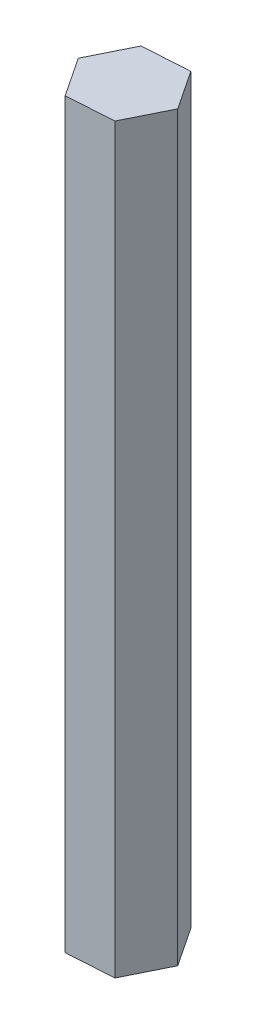
ISO-10303-21;
HEADER;
FILE_DESCRIPTION(('STEP AP214'),'2;1');
FILE_NAME('part.step','',(''),(''),'','','');
FILE_SCHEMA(('AUTOMOTIVE_DESIGN { 1 0 10303 214 1 1 1 1 }'));
ENDSEC;
DATA;
#1=APPLICATION_CONTEXT('core data for automotive mechanical design processes');
#2=APPLICATION_PROTOCOL_DEFINITION('international standard','automotive_design',2000,#1);
#3=PRODUCT_CONTEXT('',#1,'mechanical');
#4=PRODUCT('Part','Part','',(#3));
#5=PRODUCT_RELATED_PRODUCT_CATEGORY('part','',(#4));
#6=PRODUCT_DEFINITION_FORMATION('','',#4);
#7=PRODUCT_DEFINITION_CONTEXT('part definition',#1,'design');
#8=PRODUCT_DEFINITION('design','',#6,#7);
#9=PRODUCT_DEFINITION_SHAPE('','',#8);
#10=(LENGTH_UNIT() NAMED_UNIT(*) SI_UNIT(.MILLI.,.METRE.));
#11=(NAMED_UNIT(*) PLANE_ANGLE_UNIT() SI_UNIT($,.RADIAN.));
#12=(NAMED_UNIT(*) SI_UNIT($,.STERADIAN.) SOLID_ANGLE_UNIT());
#13=UNCERTAINTY_MEASURE_WITH_UNIT(LENGTH_MEASURE(1.E-05),#10,'distance_accuracy_value','');
#14=(GEOMETRIC_REPRESENTATION_CONTEXT(3) GLOBAL_UNCERTAINTY_ASSIGNED_CONTEXT((#13)) GLOBAL_UNIT_ASSIGNED_CONTEXT((#10,
#11,#12)) REPRESENTATION_CONTEXT('',''));
#15=CARTESIAN_POINT('',(0.,0.,0.));
#16=DIRECTION('',(0.,0.,1.));
#17=DIRECTION('',(1.,0.,0.));
#18=AXIS2_PLACEMENT_3D('',#15,#16,#17);
#19=CARTESIAN_POINT('',(7.31785977013899,116.078,-0.460718697162052));
#20=DIRECTION('',(-0.832897288147061,0.,0.553427599056346));
#21=DIRECTION('',(0.553427599056346,0.,0.832897288147061));
#22=AXIS2_PLACEMENT_3D('',#19,#20,#21);
#23=PLANE('',#22);
#24=DIRECTION('',(-0.553427599056346,0.,-0.832897288147061));
#25=VECTOR('',#24,1.);
#26=CARTESIAN_POINT('',(7.31785977013899,0.,-0.460718697162052));
#27=LINE('',#26,#25);
#28=CARTESIAN_POINT('',(7.31785977013899,0.,-0.460718697162052));
#29=VERTEX_POINT('',#28);
#30=CARTESIAN_POINT('',(3.25993578932869,0.,-6.56781181085354));
#31=VERTEX_POINT('',#30);
#32=EDGE_CURVE('E127',#29,#31,#27,.T.);
#33=ORIENTED_EDGE('',*,*,#32,.T.);
#34=DIRECTION('',(0.,-1.,0.));
#35=VECTOR('',#34,1.);
#36=CARTESIAN_POINT('',(3.25993578932869,116.078,-6.56781181085354));
#37=LINE('',#36,#35);
#38=CARTESIAN_POINT('',(3.25993578932869,116.078,-6.56781181085354));
#39=VERTEX_POINT('',#38);
#40=EDGE_CURVE('E11',#39,#31,#37,.T.);
#41=ORIENTED_EDGE('',*,*,#40,.F.);
#42=DIRECTION('',(-0.553427599056346,0.,-0.832897288147061));
#43=VECTOR('',#42,1.);
#44=CARTESIAN_POINT('',(7.31785977013899,116.078,-0.460718697162052));
#45=LINE('',#44,#43);
#46=CARTESIAN_POINT('',(7.31785977013899,116.078,-0.460718697162052));
#47=VERTEX_POINT('',#46);
#48=EDGE_CURVE('E137',#47,#39,#45,.T.);
#49=ORIENTED_EDGE('',*,*,#48,.F.);
#50=DIRECTION('',(0.,-1.,0.));
#51=VECTOR('',#50,1.);
#52=CARTESIAN_POINT('',(7.31785977013899,116.078,-0.460718697162052));
#53=LINE('',#52,#51);
#54=EDGE_CURVE('E123',#47,#29,#53,.T.);
#55=ORIENTED_EDGE('',*,*,#54,.T.);
#56=EDGE_LOOP('',(#33,#41,#49,#55));
#57=FACE_BOUND('',#56,.T.);
#58=ADVANCED_FACE('F43',(#57),#23,.F.);
#59=CARTESIAN_POINT('',(3.25993578932869,116.078,-6.56781181085354));
#60=DIRECTION('',(0.0628337158646939,0.,0.998024009806695));
#61=DIRECTION('',(0.998024009806695,0.,-0.0628337158646939));
#62=AXIS2_PLACEMENT_3D('',#59,#60,#61);
#63=PLANE('',#62);
#64=DIRECTION('',(-0.998024009806695,0.,0.0628337158646939));
#65=VECTOR('',#64,1.);
#66=CARTESIAN_POINT('',(3.25993578932869,0.,-6.56781181085354));
#67=LINE('',#66,#65);
#68=CARTESIAN_POINT('',(-4.0579239808103,0.,-6.10709311369149));
#69=VERTEX_POINT('',#68);
#70=EDGE_CURVE('E130',#31,#69,#67,.T.);
#71=ORIENTED_EDGE('',*,*,#70,.T.);
#72=DIRECTION('',(0.,-1.,0.));
#73=VECTOR('',#72,1.);
#74=CARTESIAN_POINT('',(-4.0579239808103,116.078,-6.10709311369149));
#75=LINE('',#74,#73);
#76=CARTESIAN_POINT('',(-4.0579239808103,116.078,-6.10709311369149));
#77=VERTEX_POINT('',#76);
#78=EDGE_CURVE('E51',#77,#69,#75,.T.);
#79=ORIENTED_EDGE('',*,*,#78,.F.);
#80=DIRECTION('',(-0.998024009806695,0.,0.0628337158646939));
#81=VECTOR('',#80,1.);
#82=CARTESIAN_POINT('',(3.25993578932869,116.078,-6.56781181085354));
#83=LINE('',#82,#81);
#84=EDGE_CURVE('E96',#39,#77,#83,.T.);
#85=ORIENTED_EDGE('',*,*,#84,.F.);
#86=ORIENTED_EDGE('',*,*,#40,.T.);
#87=EDGE_LOOP('',(#71,#79,#85,#86));
#88=FACE_BOUND('',#87,.T.);
#89=ADVANCED_FACE('F161',(#88),#63,.F.);
#90=CARTESIAN_POINT('',(-4.0579239808103,116.078,-6.10709311369149));
#91=DIRECTION('',(0.895731004011755,0.,0.444596410750349));
#92=DIRECTION('',(0.444596410750349,0.,-0.895731004011755));
#93=AXIS2_PLACEMENT_3D('',#90,#91,#92);
#94=PLANE('',#93);
#95=DIRECTION('',(-0.444596410750349,0.,0.895731004011755));
#96=VECTOR('',#95,1.);
#97=CARTESIAN_POINT('',(-4.0579239808103,0.,-6.10709311369149));
#98=LINE('',#97,#96);
#99=CARTESIAN_POINT('',(-7.31785977013899,0.,0.460718697162054));
#100=VERTEX_POINT('',#99);
#101=EDGE_CURVE('E132',#69,#100,#98,.T.);
#102=ORIENTED_EDGE('',*,*,#101,.T.);
#103=DIRECTION('',(0.,-1.,0.));
#104=VECTOR('',#103,1.);
#105=CARTESIAN_POINT('',(-7.31785977013899,116.078,0.460718697162054));
#106=LINE('',#105,#104);
#107=CARTESIAN_POINT('',(-7.31785977013899,116.078,0.460718697162054));
#108=VERTEX_POINT('',#107);
#109=EDGE_CURVE('E118',#108,#100,#106,.T.);
#110=ORIENTED_EDGE('',*,*,#109,.F.);
#111=DIRECTION('',(-0.444596410750349,0.,0.895731004011755));
#112=VECTOR('',#111,1.);
#113=CARTESIAN_POINT('',(-4.0579239808103,116.078,-6.10709311369149));
#114=LINE('',#113,#112);
#115=EDGE_CURVE('E109',#77,#108,#114,.T.);
#116=ORIENTED_EDGE('',*,*,#115,.F.);
#117=ORIENTED_EDGE('',*,*,#78,.T.);
#118=EDGE_LOOP('',(#102,#110,#116,#117));
#119=FACE_BOUND('',#118,.T.);
#120=ADVANCED_FACE('F143',(#119),#94,.F.);
#121=CARTESIAN_POINT('',(-7.31785977013899,116.078,0.460718697162054));
#122=DIRECTION('',(0.832897288147061,0.,-0.553427599056346));
#123=DIRECTION('',(-0.553427599056346,0.,-0.832897288147061));
#124=AXIS2_PLACEMENT_3D('',#121,#122,#123);
#125=PLANE('',#124);
#126=DIRECTION('',(0.553427599056346,0.,0.832897288147061));
#127=VECTOR('',#126,1.);
#128=CARTESIAN_POINT('',(-7.31785977013899,0.,0.460718697162054));
#129=LINE('',#128,#127);
#130=CARTESIAN_POINT('',(-3.25993578932868,0.,6.56781181085354));
#131=VERTEX_POINT('',#130);
#132=EDGE_CURVE('E117',#100,#131,#129,.T.);
#133=ORIENTED_EDGE('',*,*,#132,.T.);
#134=DIRECTION('',(0.,-1.,0.));
#135=VECTOR('',#134,1.);
#136=CARTESIAN_POINT('',(-3.25993578932868,116.078,6.56781181085354));
#137=LINE('',#136,#135);
#138=CARTESIAN_POINT('',(-3.25993578932868,116.078,6.56781181085354));
#139=VERTEX_POINT('',#138);
#140=EDGE_CURVE('E114',#139,#131,#137,.T.);
#141=ORIENTED_EDGE('',*,*,#140,.F.);
#142=DIRECTION('',(0.553427599056346,0.,0.832897288147061));
#143=VECTOR('',#142,1.);
#144=CARTESIAN_POINT('',(-7.31785977013899,116.078,0.460718697162054));
#145=LINE('',#144,#143);
#146=EDGE_CURVE('E103',#108,#139,#145,.T.);
#147=ORIENTED_EDGE('',*,*,#146,.F.);
#148=ORIENTED_EDGE('',*,*,#109,.T.);
#149=EDGE_LOOP('',(#133,#141,#147,#148));
#150=FACE_BOUND('',#149,.T.);
#151=ADVANCED_FACE('F115',(#150),#125,.F.);
#152=CARTESIAN_POINT('',(-3.25993578932868,116.078,6.56781181085354));
#153=DIRECTION('',(-0.0628337158646941,0.,-0.998024009806696));
#154=DIRECTION('',(-0.998024009806695,0.,0.062833715864694));
#155=AXIS2_PLACEMENT_3D('',#152,#153,#154);
#156=PLANE('',#155);
#157=DIRECTION('',(0.998024009806695,0.,-0.062833715864694));
#158=VECTOR('',#157,1.);
#159=CARTESIAN_POINT('',(-3.25993578932868,0.,6.56781181085354));
#160=LINE('',#159,#158);
#161=CARTESIAN_POINT('',(4.0579239808103,0.,6.10709311369149));
#162=VERTEX_POINT('',#161);
#163=EDGE_CURVE('E82',#131,#162,#160,.T.);
#164=ORIENTED_EDGE('',*,*,#163,.T.);
#165=DIRECTION('',(0.,-1.,0.));
#166=VECTOR('',#165,1.);
#167=CARTESIAN_POINT('',(4.0579239808103,116.078,6.10709311369149));
#168=LINE('',#167,#166);
#169=CARTESIAN_POINT('',(4.0579239808103,116.078,6.10709311369149));
#170=VERTEX_POINT('',#169);
#171=EDGE_CURVE('E119',#170,#162,#168,.T.);
#172=ORIENTED_EDGE('',*,*,#171,.F.);
#173=DIRECTION('',(0.998024009806695,0.,-0.062833715864694));
#174=VECTOR('',#173,1.);
#175=CARTESIAN_POINT('',(-3.25993578932868,116.078,6.56781181085354));
#176=LINE('',#175,#174);
#177=EDGE_CURVE('E107',#139,#170,#176,.T.);
#178=ORIENTED_EDGE('',*,*,#177,.F.);
#179=ORIENTED_EDGE('',*,*,#140,.T.);
#180=EDGE_LOOP('',(#164,#172,#178,#179));
#181=FACE_BOUND('',#180,.T.);
#182=ADVANCED_FACE('F121',(#181),#156,.F.);
#183=CARTESIAN_POINT('',(4.0579239808103,116.078,6.10709311369149));
#184=DIRECTION('',(-0.895731004011755,0.,-0.444596410750349));
#185=DIRECTION('',(-0.444596410750349,0.,0.895731004011755));
#186=AXIS2_PLACEMENT_3D('',#183,#184,#185);
#187=PLANE('',#186);
#188=DIRECTION('',(0.444596410750349,0.,-0.895731004011755));
#189=VECTOR('',#188,1.);
#190=CARTESIAN_POINT('',(4.0579239808103,0.,6.10709311369149));
#191=LINE('',#190,#189);
#192=EDGE_CURVE('E88',#162,#29,#191,.T.);
#193=ORIENTED_EDGE('',*,*,#192,.T.);
#194=ORIENTED_EDGE('',*,*,#54,.F.);
#195=DIRECTION('',(0.444596410750349,0.,-0.895731004011755));
#196=VECTOR('',#195,1.);
#197=CARTESIAN_POINT('',(4.0579239808103,116.078,6.10709311369149));
#198=LINE('',#197,#196);
#199=EDGE_CURVE('E59',#170,#47,#198,.T.);
#200=ORIENTED_EDGE('',*,*,#199,.F.);
#201=ORIENTED_EDGE('',*,*,#171,.T.);
#202=EDGE_LOOP('',(#193,#194,#200,#201));
#203=FACE_BOUND('',#202,.T.);
#204=ADVANCED_FACE('F150',(#203),#187,.F.);
#205=CARTESIAN_POINT('',(0.,116.078,0.));
#206=DIRECTION('',(0.,1.,0.));
#207=DIRECTION('',(0.,0.,1.));
#208=AXIS2_PLACEMENT_3D('',#205,#206,#207);
#209=PLANE('',#208);
#210=ORIENTED_EDGE('',*,*,#48,.T.);
#211=ORIENTED_EDGE('',*,*,#84,.T.);
#212=ORIENTED_EDGE('',*,*,#115,.T.);
#213=ORIENTED_EDGE('',*,*,#146,.T.);
#214=ORIENTED_EDGE('',*,*,#177,.T.);
#215=ORIENTED_EDGE('',*,*,#199,.T.);
#216=EDGE_LOOP('',(#210,#211,#212,#213,#214,#215));
#217=FACE_BOUND('',#216,.T.);
#218=ADVANCED_FACE('F105',(#217),#209,.T.);
#219=CARTESIAN_POINT('',(0.,0.,0.));
#220=DIRECTION('',(0.,1.,0.));
#221=DIRECTION('',(0.,0.,1.));
#222=AXIS2_PLACEMENT_3D('',#219,#220,#221);
#223=PLANE('',#222);
#224=ORIENTED_EDGE('',*,*,#32,.F.);
#225=ORIENTED_EDGE('',*,*,#192,.F.);
#226=ORIENTED_EDGE('',*,*,#163,.F.);
#227=ORIENTED_EDGE('',*,*,#132,.F.);
#228=ORIENTED_EDGE('',*,*,#101,.F.);
#229=ORIENTED_EDGE('',*,*,#70,.F.);
#230=EDGE_LOOP('',(#224,#225,#226,#227,#228,#229));
#231=FACE_BOUND('',#230,.T.);
#232=ADVANCED_FACE('F146',(#231),#223,.F.);
#233=CLOSED_SHELL('',(#58,#89,#120,#151,#182,#204,#218,#232));
#234=MANIFOLD_SOLID_BREP('B2',#233);
#235=ADVANCED_BREP_SHAPE_REPRESENTATION('',(#18,#234),#14);
#236=SHAPE_DEFINITION_REPRESENTATION(#9,#235);
ENDSEC;
END-ISO-10303-21;
